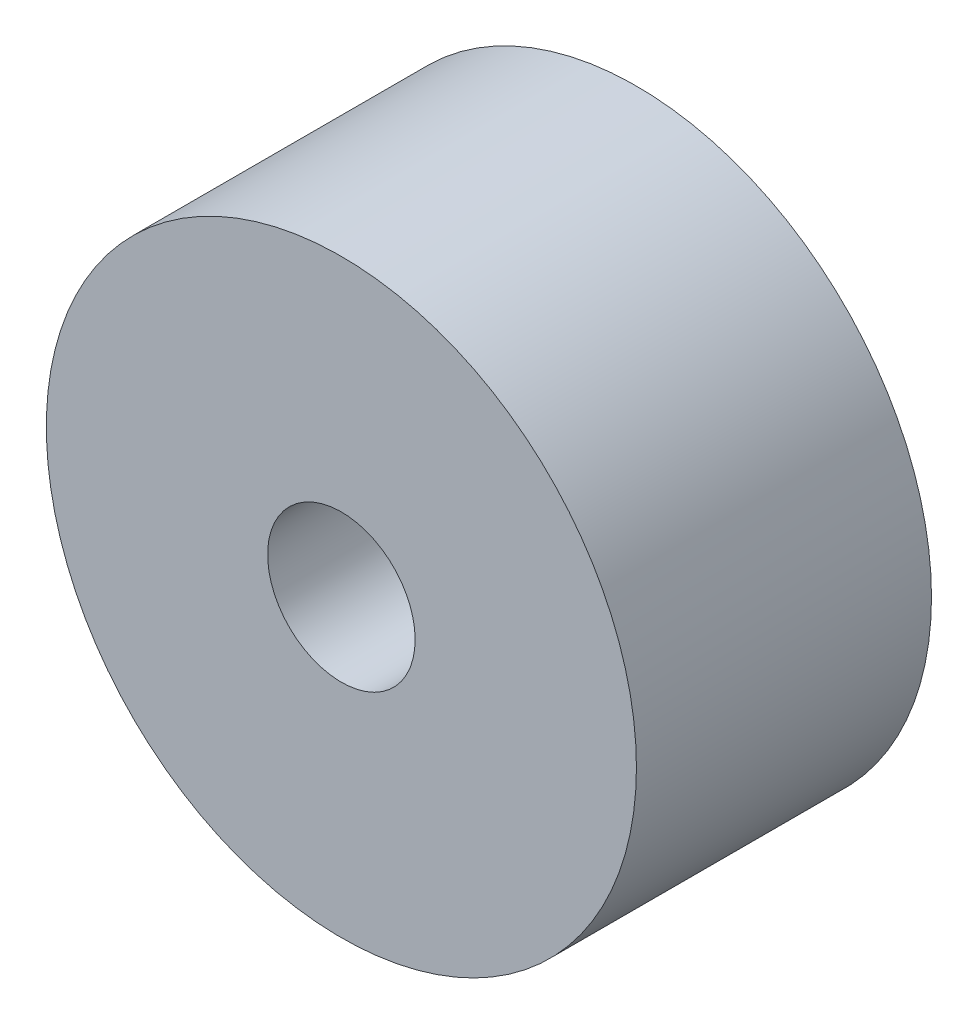
ISO-10303-21;
HEADER;
FILE_DESCRIPTION(('STEP AP214'),'2;1');
FILE_NAME('part.step','',(''),(''),'','','');
FILE_SCHEMA(('AUTOMOTIVE_DESIGN { 1 0 10303 214 1 1 1 1 }'));
ENDSEC;
DATA;
#1=APPLICATION_CONTEXT('core data for automotive mechanical design processes');
#2=APPLICATION_PROTOCOL_DEFINITION('international standard','automotive_design',2000,#1);
#3=PRODUCT_CONTEXT('',#1,'mechanical');
#4=PRODUCT('Part','Part','',(#3));
#5=PRODUCT_RELATED_PRODUCT_CATEGORY('part','',(#4));
#6=PRODUCT_DEFINITION_FORMATION('','',#4);
#7=PRODUCT_DEFINITION_CONTEXT('part definition',#1,'design');
#8=PRODUCT_DEFINITION('design','',#6,#7);
#9=PRODUCT_DEFINITION_SHAPE('','',#8);
#10=(LENGTH_UNIT() NAMED_UNIT(*) SI_UNIT(.MILLI.,.METRE.));
#11=(NAMED_UNIT(*) PLANE_ANGLE_UNIT() SI_UNIT($,.RADIAN.));
#12=(NAMED_UNIT(*) SI_UNIT($,.STERADIAN.) SOLID_ANGLE_UNIT());
#13=UNCERTAINTY_MEASURE_WITH_UNIT(LENGTH_MEASURE(1.E-05),#10,'distance_accuracy_value','');
#14=(GEOMETRIC_REPRESENTATION_CONTEXT(3) GLOBAL_UNCERTAINTY_ASSIGNED_CONTEXT((#13)) GLOBAL_UNIT_ASSIGNED_CONTEXT((#10,
#11,#12)) REPRESENTATION_CONTEXT('',''));
#15=CARTESIAN_POINT('',(0.,0.,0.));
#16=DIRECTION('',(0.,0.,1.));
#17=DIRECTION('',(1.,0.,0.));
#18=AXIS2_PLACEMENT_3D('',#15,#16,#17);
#19=CARTESIAN_POINT('',(0.,0.,10.));
#20=DIRECTION('',(0.,0.,1.));
#21=DIRECTION('',(1.,0.,0.));
#22=AXIS2_PLACEMENT_3D('',#19,#20,#21);
#23=PLANE('',#22);
#24=CARTESIAN_POINT('',(0.,0.,10.));
#25=DIRECTION('',(0.,0.,1.));
#26=DIRECTION('',(1.,0.,0.));
#27=AXIS2_PLACEMENT_3D('',#24,#25,#26);
#28=CIRCLE('',#27,10.);
#29=CARTESIAN_POINT('',(10.,0.,10.));
#30=VERTEX_POINT('',#29);
#31=EDGE_CURVE('E10',#30,#30,#28,.T.);
#32=ORIENTED_EDGE('',*,*,#31,.T.);
#33=EDGE_LOOP('',(#32));
#34=FACE_BOUND('',#33,.T.);
#35=CARTESIAN_POINT('',(0.,0.,10.));
#36=DIRECTION('',(0.,0.,1.));
#37=DIRECTION('',(1.,0.,0.));
#38=AXIS2_PLACEMENT_3D('',#35,#36,#37);
#39=CIRCLE('',#38,2.5);
#40=CARTESIAN_POINT('',(2.5,0.,10.));
#41=VERTEX_POINT('',#40);
#42=EDGE_CURVE('E48',#41,#41,#39,.T.);
#43=ORIENTED_EDGE('',*,*,#42,.F.);
#44=EDGE_LOOP('',(#43));
#45=FACE_BOUND('',#44,.T.);
#46=ADVANCED_FACE('F37',(#34,#45),#23,.T.);
#47=CARTESIAN_POINT('',(0.,0.,0.));
#48=DIRECTION('',(0.,0.,1.));
#49=DIRECTION('',(1.,0.,0.));
#50=AXIS2_PLACEMENT_3D('',#47,#48,#49);
#51=PLANE('',#50);
#52=CARTESIAN_POINT('',(0.,0.,0.));
#53=DIRECTION('',(0.,0.,1.));
#54=DIRECTION('',(1.,0.,0.));
#55=AXIS2_PLACEMENT_3D('',#52,#53,#54);
#56=CIRCLE('',#55,10.);
#57=CARTESIAN_POINT('',(10.,0.,0.));
#58=VERTEX_POINT('',#57);
#59=EDGE_CURVE('E41',#58,#58,#56,.T.);
#60=ORIENTED_EDGE('',*,*,#59,.F.);
#61=EDGE_LOOP('',(#60));
#62=FACE_BOUND('',#61,.T.);
#63=CARTESIAN_POINT('',(0.,0.,0.));
#64=DIRECTION('',(0.,0.,1.));
#65=DIRECTION('',(1.,0.,0.));
#66=AXIS2_PLACEMENT_3D('',#63,#64,#65);
#67=CIRCLE('',#66,2.5);
#68=CARTESIAN_POINT('',(2.5,0.,0.));
#69=VERTEX_POINT('',#68);
#70=EDGE_CURVE('E50',#69,#69,#67,.T.);
#71=ORIENTED_EDGE('',*,*,#70,.T.);
#72=EDGE_LOOP('',(#71));
#73=FACE_BOUND('',#72,.T.);
#74=ADVANCED_FACE('F60',(#62,#73),#51,.F.);
#75=CARTESIAN_POINT('',(0.,0.,10.));
#76=DIRECTION('',(0.,0.,-1.));
#77=DIRECTION('',(-1.,0.,0.));
#78=AXIS2_PLACEMENT_3D('',#75,#76,#77);
#79=CYLINDRICAL_SURFACE('',#78,10.);
#80=ORIENTED_EDGE('',*,*,#31,.F.);
#81=EDGE_LOOP('',(#80));
#82=FACE_BOUND('',#81,.T.);
#83=ORIENTED_EDGE('',*,*,#59,.T.);
#84=EDGE_LOOP('',(#83));
#85=FACE_BOUND('',#84,.T.);
#86=ADVANCED_FACE('F39',(#82,#85),#79,.T.);
#87=CARTESIAN_POINT('',(0.,0.,10.));
#88=DIRECTION('',(0.,0.,-1.));
#89=DIRECTION('',(-1.,0.,0.));
#90=AXIS2_PLACEMENT_3D('',#87,#88,#89);
#91=CYLINDRICAL_SURFACE('',#90,2.5);
#92=ORIENTED_EDGE('',*,*,#42,.T.);
#93=EDGE_LOOP('',(#92));
#94=FACE_BOUND('',#93,.T.);
#95=ORIENTED_EDGE('',*,*,#70,.F.);
#96=EDGE_LOOP('',(#95));
#97=FACE_BOUND('',#96,.T.);
#98=ADVANCED_FACE('F56',(#94,#97),#91,.F.);
#99=CLOSED_SHELL('',(#46,#74,#86,#98));
#100=MANIFOLD_SOLID_BREP('B2',#99);
#101=ADVANCED_BREP_SHAPE_REPRESENTATION('',(#18,#100),#14);
#102=SHAPE_DEFINITION_REPRESENTATION(#9,#101);
ENDSEC;
END-ISO-10303-21;
